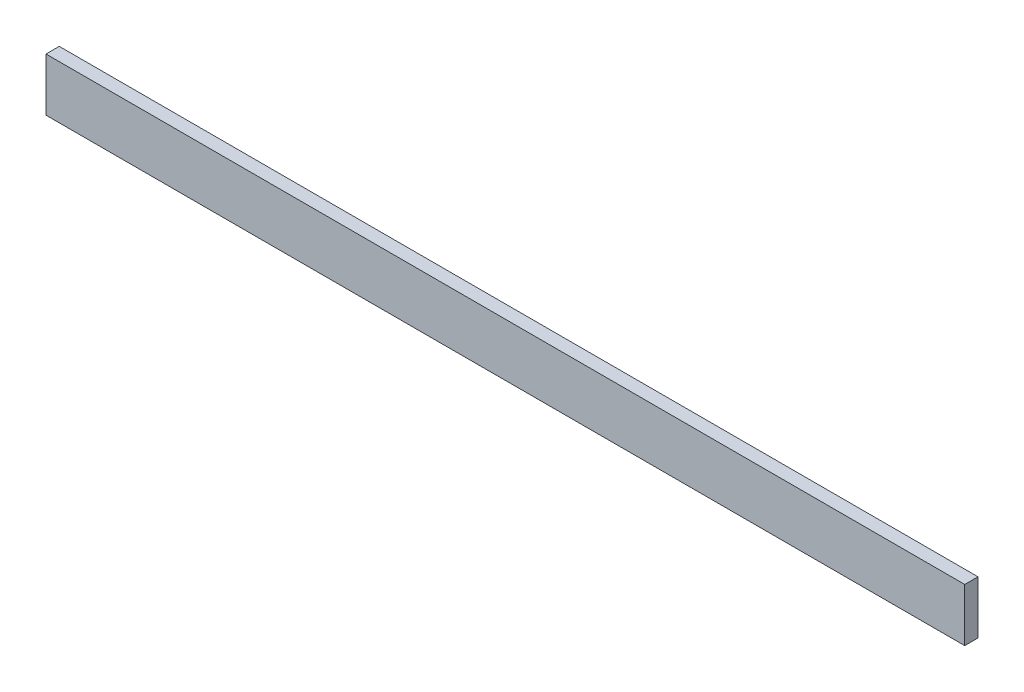
ISO-10303-21;
HEADER;
FILE_DESCRIPTION(('STEP AP214'),'2;1');
FILE_NAME('part.step','',(''),(''),'','','');
FILE_SCHEMA(('AUTOMOTIVE_DESIGN { 1 0 10303 214 1 1 1 1 }'));
ENDSEC;
DATA;
#1=APPLICATION_CONTEXT('core data for automotive mechanical design processes');
#2=APPLICATION_PROTOCOL_DEFINITION('international standard','automotive_design',2000,#1);
#3=PRODUCT_CONTEXT('',#1,'mechanical');
#4=PRODUCT('Part','Part','',(#3));
#5=PRODUCT_RELATED_PRODUCT_CATEGORY('part','',(#4));
#6=PRODUCT_DEFINITION_FORMATION('','',#4);
#7=PRODUCT_DEFINITION_CONTEXT('part definition',#1,'design');
#8=PRODUCT_DEFINITION('design','',#6,#7);
#9=PRODUCT_DEFINITION_SHAPE('','',#8);
#10=(LENGTH_UNIT() NAMED_UNIT(*) SI_UNIT(.MILLI.,.METRE.));
#11=(NAMED_UNIT(*) PLANE_ANGLE_UNIT() SI_UNIT($,.RADIAN.));
#12=(NAMED_UNIT(*) SI_UNIT($,.STERADIAN.) SOLID_ANGLE_UNIT());
#13=UNCERTAINTY_MEASURE_WITH_UNIT(LENGTH_MEASURE(1.E-05),#10,'distance_accuracy_value','');
#14=(GEOMETRIC_REPRESENTATION_CONTEXT(3) GLOBAL_UNCERTAINTY_ASSIGNED_CONTEXT((#13)) GLOBAL_UNIT_ASSIGNED_CONTEXT((#10,
#11,#12)) REPRESENTATION_CONTEXT('',''));
#15=CARTESIAN_POINT('',(0.,0.,0.));
#16=DIRECTION('',(0.,0.,1.));
#17=DIRECTION('',(1.,0.,0.));
#18=AXIS2_PLACEMENT_3D('',#15,#16,#17);
#19=CARTESIAN_POINT('',(-59.767038071066,4.51108291032149,3.));
#20=DIRECTION('',(1.,0.,0.));
#21=DIRECTION('',(0.,1.,0.));
#22=AXIS2_PLACEMENT_3D('',#19,#20,#21);
#23=PLANE('',#22);
#24=DIRECTION('',(0.,-1.,0.));
#25=VECTOR('',#24,1.);
#26=CARTESIAN_POINT('',(-59.767038071066,4.51108291032149,0.));
#27=LINE('',#26,#25);
#28=CARTESIAN_POINT('',(-59.767038071066,4.51108291032149,0.));
#29=VERTEX_POINT('',#28);
#30=CARTESIAN_POINT('',(-59.767038071066,-7.48891708967851,0.));
#31=VERTEX_POINT('',#30);
#32=EDGE_CURVE('E96',#29,#31,#27,.T.);
#33=ORIENTED_EDGE('',*,*,#32,.T.);
#34=DIRECTION('',(0.,0.,-1.));
#35=VECTOR('',#34,1.);
#36=CARTESIAN_POINT('',(-59.767038071066,-7.48891708967851,3.));
#37=LINE('',#36,#35);
#38=CARTESIAN_POINT('',(-59.767038071066,-7.48891708967851,3.));
#39=VERTEX_POINT('',#38);
#40=EDGE_CURVE('E11',#39,#31,#37,.T.);
#41=ORIENTED_EDGE('',*,*,#40,.F.);
#42=DIRECTION('',(0.,-1.,0.));
#43=VECTOR('',#42,1.);
#44=CARTESIAN_POINT('',(-59.767038071066,4.51108291032149,3.));
#45=LINE('',#44,#43);
#46=CARTESIAN_POINT('',(-59.767038071066,4.51108291032149,3.));
#47=VERTEX_POINT('',#46);
#48=EDGE_CURVE('E84',#47,#39,#45,.T.);
#49=ORIENTED_EDGE('',*,*,#48,.F.);
#50=DIRECTION('',(0.,0.,-1.));
#51=VECTOR('',#50,1.);
#52=CARTESIAN_POINT('',(-59.767038071066,4.51108291032149,3.));
#53=LINE('',#52,#51);
#54=EDGE_CURVE('E92',#47,#29,#53,.T.);
#55=ORIENTED_EDGE('',*,*,#54,.T.);
#56=EDGE_LOOP('',(#33,#41,#49,#55));
#57=FACE_BOUND('',#56,.T.);
#58=ADVANCED_FACE('F33',(#57),#23,.F.);
#59=CARTESIAN_POINT('',(-59.767038071066,-7.48891708967851,3.));
#60=DIRECTION('',(0.,1.,0.));
#61=DIRECTION('',(0.,0.,1.));
#62=AXIS2_PLACEMENT_3D('',#59,#60,#61);
#63=PLANE('',#62);
#64=DIRECTION('',(1.,0.,0.));
#65=VECTOR('',#64,1.);
#66=CARTESIAN_POINT('',(-59.767038071066,-7.48891708967851,0.));
#67=LINE('',#66,#65);
#68=CARTESIAN_POINT('',(148.232961928934,-7.48891708967851,0.));
#69=VERTEX_POINT('',#68);
#70=EDGE_CURVE('E88',#31,#69,#67,.T.);
#71=ORIENTED_EDGE('',*,*,#70,.T.);
#72=DIRECTION('',(0.,0.,-1.));
#73=VECTOR('',#72,1.);
#74=CARTESIAN_POINT('',(148.232961928934,-7.48891708967851,3.));
#75=LINE('',#74,#73);
#76=CARTESIAN_POINT('',(148.232961928934,-7.48891708967851,3.));
#77=VERTEX_POINT('',#76);
#78=EDGE_CURVE('E41',#77,#69,#75,.T.);
#79=ORIENTED_EDGE('',*,*,#78,.F.);
#80=DIRECTION('',(1.,0.,0.));
#81=VECTOR('',#80,1.);
#82=CARTESIAN_POINT('',(-59.767038071066,-7.48891708967851,3.));
#83=LINE('',#82,#81);
#84=EDGE_CURVE('E79',#39,#77,#83,.T.);
#85=ORIENTED_EDGE('',*,*,#84,.F.);
#86=ORIENTED_EDGE('',*,*,#40,.T.);
#87=EDGE_LOOP('',(#71,#79,#85,#86));
#88=FACE_BOUND('',#87,.T.);
#89=ADVANCED_FACE('F87',(#88),#63,.F.);
#90=CARTESIAN_POINT('',(148.232961928934,4.51108291032149,3.));
#91=DIRECTION('',(-1.,0.,0.));
#92=DIRECTION('',(0.,0.,1.));
#93=AXIS2_PLACEMENT_3D('',#90,#91,#92);
#94=PLANE('',#93);
#95=DIRECTION('',(0.,1.,0.));
#96=VECTOR('',#95,1.);
#97=CARTESIAN_POINT('',(148.232961928934,4.51108291032149,0.));
#98=LINE('',#97,#96);
#99=CARTESIAN_POINT('',(148.232961928934,4.51108291032149,0.));
#100=VERTEX_POINT('',#99);
#101=EDGE_CURVE('E66',#69,#100,#98,.T.);
#102=ORIENTED_EDGE('',*,*,#101,.T.);
#103=DIRECTION('',(0.,0.,-1.));
#104=VECTOR('',#103,1.);
#105=CARTESIAN_POINT('',(148.232961928934,4.51108291032149,3.));
#106=LINE('',#105,#104);
#107=CARTESIAN_POINT('',(148.232961928934,4.51108291032149,3.));
#108=VERTEX_POINT('',#107);
#109=EDGE_CURVE('E89',#108,#100,#106,.T.);
#110=ORIENTED_EDGE('',*,*,#109,.F.);
#111=DIRECTION('',(0.,1.,0.));
#112=VECTOR('',#111,1.);
#113=CARTESIAN_POINT('',(148.232961928934,4.51108291032149,3.));
#114=LINE('',#113,#112);
#115=EDGE_CURVE('E82',#77,#108,#114,.T.);
#116=ORIENTED_EDGE('',*,*,#115,.F.);
#117=ORIENTED_EDGE('',*,*,#78,.T.);
#118=EDGE_LOOP('',(#102,#110,#116,#117));
#119=FACE_BOUND('',#118,.T.);
#120=ADVANCED_FACE('F90',(#119),#94,.F.);
#121=CARTESIAN_POINT('',(-59.767038071066,4.51108291032149,3.));
#122=DIRECTION('',(0.,-1.,0.));
#123=DIRECTION('',(0.,0.,-1.));
#124=AXIS2_PLACEMENT_3D('',#121,#122,#123);
#125=PLANE('',#124);
#126=DIRECTION('',(-1.,0.,0.));
#127=VECTOR('',#126,1.);
#128=CARTESIAN_POINT('',(-59.767038071066,4.51108291032149,0.));
#129=LINE('',#128,#127);
#130=EDGE_CURVE('E72',#100,#29,#129,.T.);
#131=ORIENTED_EDGE('',*,*,#130,.T.);
#132=ORIENTED_EDGE('',*,*,#54,.F.);
#133=DIRECTION('',(-1.,0.,0.));
#134=VECTOR('',#133,1.);
#135=CARTESIAN_POINT('',(-59.767038071066,4.51108291032149,3.));
#136=LINE('',#135,#134);
#137=EDGE_CURVE('E49',#108,#47,#136,.T.);
#138=ORIENTED_EDGE('',*,*,#137,.F.);
#139=ORIENTED_EDGE('',*,*,#109,.T.);
#140=EDGE_LOOP('',(#131,#132,#138,#139));
#141=FACE_BOUND('',#140,.T.);
#142=ADVANCED_FACE('F103',(#141),#125,.F.);
#143=CARTESIAN_POINT('',(0.,0.,3.));
#144=DIRECTION('',(0.,0.,1.));
#145=DIRECTION('',(1.,0.,0.));
#146=AXIS2_PLACEMENT_3D('',#143,#144,#145);
#147=PLANE('',#146);
#148=ORIENTED_EDGE('',*,*,#48,.T.);
#149=ORIENTED_EDGE('',*,*,#84,.T.);
#150=ORIENTED_EDGE('',*,*,#115,.T.);
#151=ORIENTED_EDGE('',*,*,#137,.T.);
#152=EDGE_LOOP('',(#148,#149,#150,#151));
#153=FACE_BOUND('',#152,.T.);
#154=ADVANCED_FACE('F80',(#153),#147,.T.);
#155=CARTESIAN_POINT('',(0.,0.,0.));
#156=DIRECTION('',(0.,0.,1.));
#157=DIRECTION('',(1.,0.,0.));
#158=AXIS2_PLACEMENT_3D('',#155,#156,#157);
#159=PLANE('',#158);
#160=ORIENTED_EDGE('',*,*,#32,.F.);
#161=ORIENTED_EDGE('',*,*,#130,.F.);
#162=ORIENTED_EDGE('',*,*,#101,.F.);
#163=ORIENTED_EDGE('',*,*,#70,.F.);
#164=EDGE_LOOP('',(#160,#161,#162,#163));
#165=FACE_BOUND('',#164,.T.);
#166=ADVANCED_FACE('F106',(#165),#159,.F.);
#167=CLOSED_SHELL('',(#58,#89,#120,#142,#154,#166));
#168=MANIFOLD_SOLID_BREP('B2',#167);
#169=ADVANCED_BREP_SHAPE_REPRESENTATION('',(#18,#168),#14);
#170=SHAPE_DEFINITION_REPRESENTATION(#9,#169);
ENDSEC;
END-ISO-10303-21;
